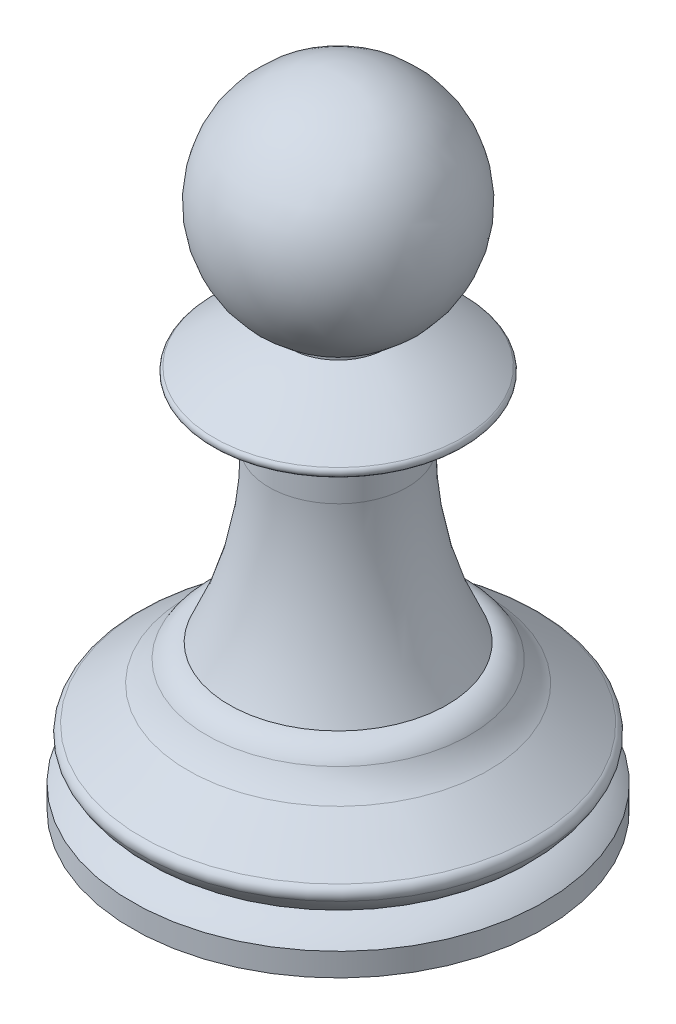
ISO-10303-21;
HEADER;
FILE_DESCRIPTION(('STEP AP214'),'2;1');
FILE_NAME('part.step','',(''),(''),'','','');
FILE_SCHEMA(('AUTOMOTIVE_DESIGN { 1 0 10303 214 1 1 1 1 }'));
ENDSEC;
DATA;
#1=APPLICATION_CONTEXT('core data for automotive mechanical design processes');
#2=APPLICATION_PROTOCOL_DEFINITION('international standard','automotive_design',2000,#1);
#3=PRODUCT_CONTEXT('',#1,'mechanical');
#4=PRODUCT('Part','Part','',(#3));
#5=PRODUCT_RELATED_PRODUCT_CATEGORY('part','',(#4));
#6=PRODUCT_DEFINITION_FORMATION('','',#4);
#7=PRODUCT_DEFINITION_CONTEXT('part definition',#1,'design');
#8=PRODUCT_DEFINITION('design','',#6,#7);
#9=PRODUCT_DEFINITION_SHAPE('','',#8);
#10=(LENGTH_UNIT() NAMED_UNIT(*) SI_UNIT(.MILLI.,.METRE.));
#11=(NAMED_UNIT(*) PLANE_ANGLE_UNIT() SI_UNIT($,.RADIAN.));
#12=(NAMED_UNIT(*) SI_UNIT($,.STERADIAN.) SOLID_ANGLE_UNIT());
#13=UNCERTAINTY_MEASURE_WITH_UNIT(LENGTH_MEASURE(1.E-05),#10,'distance_accuracy_value','');
#14=(GEOMETRIC_REPRESENTATION_CONTEXT(3) GLOBAL_UNCERTAINTY_ASSIGNED_CONTEXT((#13)) GLOBAL_UNIT_ASSIGNED_CONTEXT((#10,
#11,#12)) REPRESENTATION_CONTEXT('',''));
#15=CARTESIAN_POINT('',(0.,0.,0.));
#16=DIRECTION('',(0.,0.,1.));
#17=DIRECTION('',(1.,0.,0.));
#18=AXIS2_PLACEMENT_3D('',#15,#16,#17);
#19=CARTESIAN_POINT('',(0.,30.6193045973774,0.));
#20=DIRECTION('',(0.,-1.,0.));
#21=DIRECTION('',(1.,0.,0.));
#22=AXIS2_PLACEMENT_3D('',#19,#20,#21);
#23=SPHERICAL_SURFACE('',#22,6.40751126487739);
#24=CARTESIAN_POINT('',(0.,24.8454301571985,0.));
#25=DIRECTION('',(0.,-1.,0.));
#26=DIRECTION('',(0.,0.,-1.));
#27=AXIS2_PLACEMENT_3D('',#24,#25,#26);
#28=CIRCLE('',#27,2.77823227225145);
#29=CARTESIAN_POINT('',(0.,24.8454301571985,-2.77823227225145));
#30=VERTEX_POINT('',#29);
#31=EDGE_CURVE('E10',#30,#30,#28,.T.);
#32=ORIENTED_EDGE('',*,*,#31,.F.);
#33=EDGE_LOOP('',(#32));
#34=FACE_BOUND('',#33,.T.);
#35=ADVANCED_FACE('F32',(#34),#23,.T.);
#36=CARTESIAN_POINT('',(0.,0.,0.));
#37=DIRECTION('',(0.,-1.,0.));
#38=DIRECTION('',(0.,0.,-1.));
#39=AXIS2_PLACEMENT_3D('',#36,#37,#38);
#40=CYLINDRICAL_SURFACE('',#39,2.77823227225144);
#41=CARTESIAN_POINT('',(0.,24.5980837262947,0.));
#42=DIRECTION('',(0.,-1.,0.));
#43=DIRECTION('',(0.,0.,-1.));
#44=AXIS2_PLACEMENT_3D('',#41,#42,#43);
#45=CIRCLE('',#44,2.77823227225144);
#46=CARTESIAN_POINT('',(0.,24.5980837262947,-2.77823227225144));
#47=VERTEX_POINT('',#46);
#48=EDGE_CURVE('E38',#47,#47,#45,.T.);
#49=ORIENTED_EDGE('',*,*,#48,.F.);
#50=EDGE_LOOP('',(#49));
#51=FACE_BOUND('',#50,.T.);
#52=ORIENTED_EDGE('',*,*,#31,.T.);
#53=EDGE_LOOP('',(#52));
#54=FACE_BOUND('',#53,.T.);
#55=ADVANCED_FACE('F152',(#51,#54),#40,.T.);
#56=CARTESIAN_POINT('',(0.,7.29470584901323,0.));
#57=DIRECTION('',(0.,-1.,0.));
#58=DIRECTION('',(0.,0.,-1.));
#59=AXIS2_PLACEMENT_3D('',#56,#57,#58);
#60=DEGENERATE_TOROIDAL_SURFACE('',#59,3.32480585590459,18.3481323397702,.F.);
#61=CARTESIAN_POINT('',(0.,22.3200441808503,0.));
#62=DIRECTION('',(0.,-1.,0.));
#63=DIRECTION('',(0.,0.,-1.));
#64=AXIS2_PLACEMENT_3D('',#61,#62,#63);
#65=CIRCLE('',#64,7.20577667174053);
#66=CARTESIAN_POINT('',(0.,22.3200441808503,-7.20577667174053));
#67=VERTEX_POINT('',#66);
#68=EDGE_CURVE('E42',#67,#67,#65,.T.);
#69=ORIENTED_EDGE('',*,*,#68,.F.);
#70=EDGE_LOOP('',(#69));
#71=FACE_BOUND('',#70,.T.);
#72=ORIENTED_EDGE('',*,*,#48,.T.);
#73=EDGE_LOOP('',(#72));
#74=FACE_BOUND('',#73,.T.);
#75=ADVANCED_FACE('F147',(#71,#74),#60,.F.);
#76=CARTESIAN_POINT('',(0.,22.0811345936335,0.));
#77=DIRECTION('',(0.,-1.,0.));
#78=DIRECTION('',(0.,0.,-1.));
#79=AXIS2_PLACEMENT_3D('',#76,#77,#78);
#80=TOROIDAL_SURFACE('',#79,7.03833570839784,0.291743495333246);
#81=CARTESIAN_POINT('',(0.,21.7998474880832,0.));
#82=DIRECTION('',(0.,-1.,0.));
#83=DIRECTION('',(0.,0.,-1.));
#84=AXIS2_PLACEMENT_3D('',#81,#82,#83);
#85=CIRCLE('',#84,7.11574262876273);
#86=CARTESIAN_POINT('',(0.,21.7998474880832,-7.11574262876273));
#87=VERTEX_POINT('',#86);
#88=EDGE_CURVE('E46',#87,#87,#85,.T.);
#89=ORIENTED_EDGE('',*,*,#88,.F.);
#90=EDGE_LOOP('',(#89));
#91=FACE_BOUND('',#90,.T.);
#92=ORIENTED_EDGE('',*,*,#68,.T.);
#93=EDGE_LOOP('',(#92));
#94=FACE_BOUND('',#93,.T.);
#95=ADVANCED_FACE('F141',(#91,#94),#80,.T.);
#96=CARTESIAN_POINT('',(0.,40.8972567139371,0.));
#97=DIRECTION('',(0.,-1.,0.));
#98=DIRECTION('',(0.,0.,-1.));
#99=AXIS2_PLACEMENT_3D('',#96,#97,#98);
#100=DEGENERATE_TOROIDAL_SURFACE('',#99,1.86035905108762,19.8073242940138,.T.);
#101=CARTESIAN_POINT('',(0.,21.2081638422329,0.));
#102=DIRECTION('',(0.,-1.,0.));
#103=DIRECTION('',(0.,0.,-1.));
#104=AXIS2_PLACEMENT_3D('',#101,#102,#103);
#105=CIRCLE('',#104,4.02131198385498);
#106=CARTESIAN_POINT('',(0.,21.2081638422329,-4.02131198385498));
#107=VERTEX_POINT('',#106);
#108=EDGE_CURVE('E51',#107,#107,#105,.T.);
#109=ORIENTED_EDGE('',*,*,#108,.F.);
#110=EDGE_LOOP('',(#109));
#111=FACE_BOUND('',#110,.T.);
#112=ORIENTED_EDGE('',*,*,#88,.T.);
#113=EDGE_LOOP('',(#112));
#114=FACE_BOUND('',#113,.T.);
#115=ADVANCED_FACE('F135',(#111,#114),#100,.T.);
#116=CARTESIAN_POINT('',(0.,0.,0.));
#117=DIRECTION('',(0.,-1.,0.));
#118=DIRECTION('',(0.,0.,-1.));
#119=AXIS2_PLACEMENT_3D('',#116,#117,#118);
#120=CYLINDRICAL_SURFACE('',#119,4.02131198385498);
#121=CARTESIAN_POINT('',(0.,18.2445542306115,0.));
#122=DIRECTION('',(0.,-1.,0.));
#123=DIRECTION('',(0.,0.,-1.));
#124=AXIS2_PLACEMENT_3D('',#121,#122,#123);
#125=CIRCLE('',#124,4.02131198385498);
#126=CARTESIAN_POINT('',(0.,18.2445542306115,-4.02131198385498));
#127=VERTEX_POINT('',#126);
#128=EDGE_CURVE('E54',#127,#127,#125,.T.);
#129=ORIENTED_EDGE('',*,*,#128,.F.);
#130=EDGE_LOOP('',(#129));
#131=FACE_BOUND('',#130,.T.);
#132=ORIENTED_EDGE('',*,*,#108,.T.);
#133=EDGE_LOOP('',(#132));
#134=FACE_BOUND('',#133,.T.);
#135=ADVANCED_FACE('F129',(#131,#134),#120,.T.);
#136=CARTESIAN_POINT('',(0.,18.2445542306115,0.));
#137=DIRECTION('',(0.,-1.,0.));
#138=DIRECTION('',(0.,0.,-1.));
#139=AXIS2_PLACEMENT_3D('',#136,#137,#138);
#140=TOROIDAL_SURFACE('',#139,25.9777514989305,21.9564395150756);
#141=CARTESIAN_POINT('',(0.,8.44383992078883,0.));
#142=DIRECTION('',(0.,-1.,0.));
#143=DIRECTION('',(0.,0.,-1.));
#144=AXIS2_PLACEMENT_3D('',#141,#142,#143);
#145=CIRCLE('',#144,6.3300738958038);
#146=CARTESIAN_POINT('',(0.,8.44383992078883,-6.3300738958038));
#147=VERTEX_POINT('',#146);
#148=EDGE_CURVE('E57',#147,#147,#145,.T.);
#149=ORIENTED_EDGE('',*,*,#148,.F.);
#150=EDGE_LOOP('',(#149));
#151=FACE_BOUND('',#150,.T.);
#152=ORIENTED_EDGE('',*,*,#128,.T.);
#153=EDGE_LOOP('',(#152));
#154=FACE_BOUND('',#153,.T.);
#155=ADVANCED_FACE('F123',(#151,#154),#140,.F.);
#156=CARTESIAN_POINT('',(0.,6.72991668292193,0.));
#157=DIRECTION('',(0.,-1.,0.));
#158=DIRECTION('',(0.,0.,-1.));
#159=AXIS2_PLACEMENT_3D('',#156,#157,#158);
#160=TOROIDAL_SURFACE('',#159,6.15685682582747,1.72265406237913);
#161=CARTESIAN_POINT('',(0.,7.58559738322718,0.));
#162=DIRECTION('',(0.,-1.,0.));
#163=DIRECTION('',(0.,0.,-1.));
#164=AXIS2_PLACEMENT_3D('',#161,#162,#163);
#165=CIRCLE('',#164,7.6519647007838);
#166=CARTESIAN_POINT('',(0.,7.58559738322718,-7.6519647007838));
#167=VERTEX_POINT('',#166);
#168=EDGE_CURVE('E60',#167,#167,#165,.T.);
#169=ORIENTED_EDGE('',*,*,#168,.F.);
#170=EDGE_LOOP('',(#169));
#171=FACE_BOUND('',#170,.T.);
#172=ORIENTED_EDGE('',*,*,#148,.T.);
#173=EDGE_LOOP('',(#172));
#174=FACE_BOUND('',#173,.T.);
#175=ADVANCED_FACE('F117',(#171,#174),#160,.T.);
#176=CARTESIAN_POINT('',(0.,9.6205898232783,0.));
#177=DIRECTION('',(0.,-1.,0.));
#178=DIRECTION('',(0.,0.,-1.));
#179=AXIS2_PLACEMENT_3D('',#176,#177,#178);
#180=TOROIDAL_SURFACE('',#179,11.207652262174,4.09684125458751);
#181=CARTESIAN_POINT('',(0.,6.35249028902942,0.));
#182=DIRECTION('',(0.,-1.,0.));
#183=DIRECTION('',(0.,0.,-1.));
#184=AXIS2_PLACEMENT_3D('',#181,#182,#183);
#185=CIRCLE('',#184,8.73709894367783);
#186=CARTESIAN_POINT('',(0.,6.35249028902942,-8.73709894367783));
#187=VERTEX_POINT('',#186);
#188=EDGE_CURVE('E63',#187,#187,#185,.T.);
#189=ORIENTED_EDGE('',*,*,#188,.F.);
#190=EDGE_LOOP('',(#189));
#191=FACE_BOUND('',#190,.T.);
#192=ORIENTED_EDGE('',*,*,#168,.T.);
#193=EDGE_LOOP('',(#192));
#194=FACE_BOUND('',#193,.T.);
#195=ADVANCED_FACE('F111',(#191,#194),#180,.F.);
#196=CARTESIAN_POINT('',(0.,6.35249028902942,0.));
#197=DIRECTION('',(0.,-1.,0.));
#198=DIRECTION('',(0.,0.,-1.));
#199=AXIS2_PLACEMENT_3D('',#196,#197,#198);
#200=CONICAL_SURFACE('',#199,8.73709894367783,0.923491562732976);
#201=CARTESIAN_POINT('',(0.,4.33001134842079,0.));
#202=DIRECTION('',(0.,-1.,0.));
#203=DIRECTION('',(0.,0.,-1.));
#204=AXIS2_PLACEMENT_3D('',#201,#202,#203);
#205=CIRCLE('',#204,11.4124763315476);
#206=CARTESIAN_POINT('',(0.,4.33001134842079,-11.4124763315476));
#207=VERTEX_POINT('',#206);
#208=EDGE_CURVE('E66',#207,#207,#205,.T.);
#209=ORIENTED_EDGE('',*,*,#208,.F.);
#210=EDGE_LOOP('',(#209));
#211=FACE_BOUND('',#210,.T.);
#212=ORIENTED_EDGE('',*,*,#188,.T.);
#213=EDGE_LOOP('',(#212));
#214=FACE_BOUND('',#213,.T.);
#215=ADVANCED_FACE('F105',(#211,#214),#200,.T.);
#216=CARTESIAN_POINT('',(0.,3.86178324938526,0.));
#217=DIRECTION('',(0.,-1.,0.));
#218=DIRECTION('',(0.,0.,-1.));
#219=AXIS2_PLACEMENT_3D('',#216,#217,#218);
#220=TOROIDAL_SURFACE('',#219,11.1638444812041,0.530146536093221);
#221=CARTESIAN_POINT('',(0.,3.61315139904179,0.));
#222=DIRECTION('',(0.,-1.,0.));
#223=DIRECTION('',(0.,0.,-1.));
#224=AXIS2_PLACEMENT_3D('',#221,#222,#223);
#225=CIRCLE('',#224,11.6320725802396);
#226=CARTESIAN_POINT('',(0.,3.61315139904179,-11.6320725802396));
#227=VERTEX_POINT('',#226);
#228=EDGE_CURVE('E69',#227,#227,#225,.T.);
#229=ORIENTED_EDGE('',*,*,#228,.F.);
#230=EDGE_LOOP('',(#229));
#231=FACE_BOUND('',#230,.T.);
#232=ORIENTED_EDGE('',*,*,#208,.T.);
#233=EDGE_LOOP('',(#232));
#234=FACE_BOUND('',#233,.T.);
#235=ADVANCED_FACE('F99',(#231,#234),#220,.T.);
#236=CARTESIAN_POINT('',(0.,5.18903669499165,0.));
#237=DIRECTION('',(0.,-1.,0.));
#238=DIRECTION('',(0.,0.,-1.));
#239=AXIS2_PLACEMENT_3D('',#236,#237,#238);
#240=TOROIDAL_SURFACE('',#239,8.66433624476496,3.36018949211018);
#241=CARTESIAN_POINT('',(0.,2.31452154086359,0.));
#242=DIRECTION('',(0.,-1.,0.));
#243=DIRECTION('',(0.,0.,-1.));
#244=AXIS2_PLACEMENT_3D('',#241,#242,#243);
#245=CIRCLE('',#244,10.4044615424306);
#246=CARTESIAN_POINT('',(0.,2.31452154086359,-10.4044615424306));
#247=VERTEX_POINT('',#246);
#248=EDGE_CURVE('E72',#247,#247,#245,.T.);
#249=ORIENTED_EDGE('',*,*,#248,.F.);
#250=EDGE_LOOP('',(#249));
#251=FACE_BOUND('',#250,.T.);
#252=ORIENTED_EDGE('',*,*,#228,.T.);
#253=EDGE_LOOP('',(#252));
#254=FACE_BOUND('',#253,.T.);
#255=ADVANCED_FACE('F93',(#251,#254),#240,.T.);
#256=CARTESIAN_POINT('',(0.,-2.2837029860442,0.));
#257=DIRECTION('',(0.,-1.,0.));
#258=DIRECTION('',(0.,0.,-1.));
#259=AXIS2_PLACEMENT_3D('',#256,#257,#258);
#260=TOROIDAL_SURFACE('',#259,8.62862610266171,4.92922512257205);
#261=CARTESIAN_POINT('',(0.,1.34028337630383,0.));
#262=DIRECTION('',(0.,-1.,0.));
#263=DIRECTION('',(0.,0.,-1.));
#264=AXIS2_PLACEMENT_3D('',#261,#262,#263);
#265=CIRCLE('',#264,11.969880830232);
#266=CARTESIAN_POINT('',(0.,1.34028337630383,-11.969880830232));
#267=VERTEX_POINT('',#266);
#268=EDGE_CURVE('E75',#267,#267,#265,.T.);
#269=ORIENTED_EDGE('',*,*,#268,.F.);
#270=EDGE_LOOP('',(#269));
#271=FACE_BOUND('',#270,.T.);
#272=ORIENTED_EDGE('',*,*,#248,.T.);
#273=EDGE_LOOP('',(#272));
#274=FACE_BOUND('',#273,.T.);
#275=ADVANCED_FACE('F87',(#271,#274),#260,.T.);
#276=CARTESIAN_POINT('',(0.,0.,0.));
#277=DIRECTION('',(0.,-1.,0.));
#278=DIRECTION('',(0.,0.,-1.));
#279=AXIS2_PLACEMENT_3D('',#276,#277,#278);
#280=CYLINDRICAL_SURFACE('',#279,11.969880830232);
#281=CARTESIAN_POINT('',(0.,0.,0.));
#282=DIRECTION('',(0.,-1.,0.));
#283=DIRECTION('',(0.,0.,-1.));
#284=AXIS2_PLACEMENT_3D('',#281,#282,#283);
#285=CIRCLE('',#284,11.969880830232);
#286=CARTESIAN_POINT('',(0.,0.,-11.969880830232));
#287=VERTEX_POINT('',#286);
#288=EDGE_CURVE('E78',#287,#287,#285,.T.);
#289=ORIENTED_EDGE('',*,*,#288,.F.);
#290=EDGE_LOOP('',(#289));
#291=FACE_BOUND('',#290,.T.);
#292=ORIENTED_EDGE('',*,*,#268,.T.);
#293=EDGE_LOOP('',(#292));
#294=FACE_BOUND('',#293,.T.);
#295=ADVANCED_FACE('F84',(#291,#294),#280,.T.);
#296=CARTESIAN_POINT('',(0.,0.,0.));
#297=DIRECTION('',(0.,1.,0.));
#298=DIRECTION('',(0.,0.,1.));
#299=AXIS2_PLACEMENT_3D('',#296,#297,#298);
#300=PLANE('',#299);
#301=ORIENTED_EDGE('',*,*,#288,.T.);
#302=EDGE_LOOP('',(#301));
#303=FACE_BOUND('',#302,.T.);
#304=ADVANCED_FACE('F82',(#303),#300,.F.);
#305=CLOSED_SHELL('',(#35,#55,#75,#95,#115,#135,#155,#175,#195,#215,#235,#255,#275,#295,#304));
#306=MANIFOLD_SOLID_BREP('B2',#305);
#307=ADVANCED_BREP_SHAPE_REPRESENTATION('',(#18,#306),#14);
#308=SHAPE_DEFINITION_REPRESENTATION(#9,#307);
ENDSEC;
END-ISO-10303-21;
